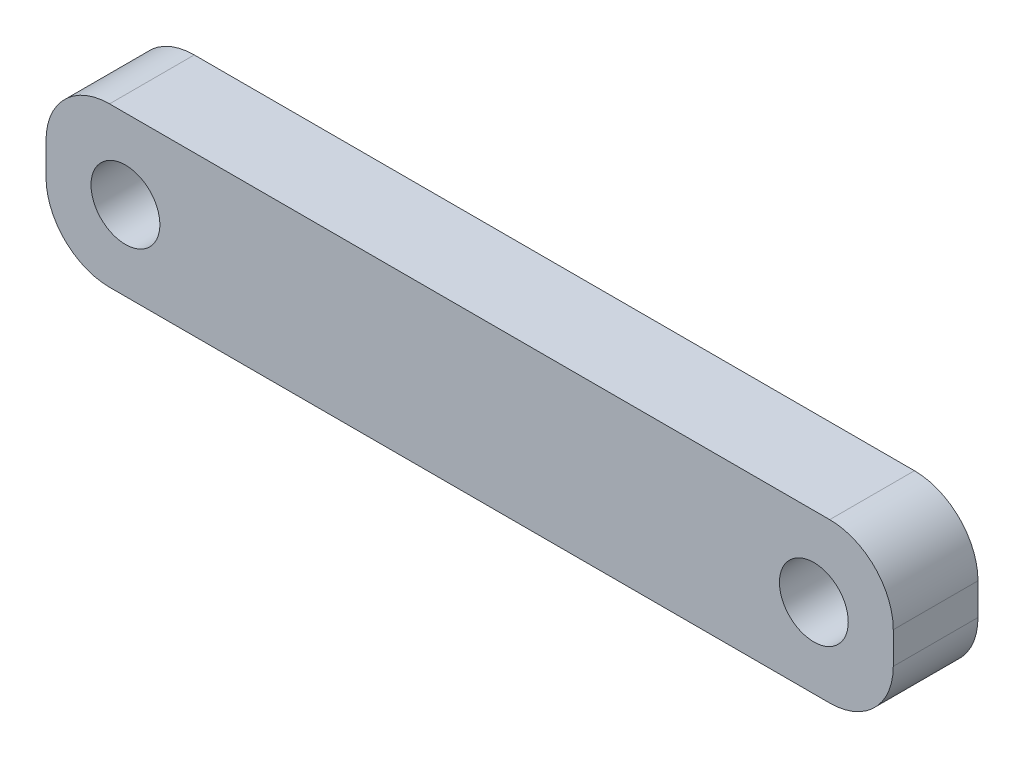
ISO-10303-21;
HEADER;
FILE_DESCRIPTION(('STEP AP214'),'2;1');
FILE_NAME('part.step','',(''),(''),'','','');
FILE_SCHEMA(('AUTOMOTIVE_DESIGN { 1 0 10303 214 1 1 1 1 }'));
ENDSEC;
DATA;
#1=APPLICATION_CONTEXT('core data for automotive mechanical design processes');
#2=APPLICATION_PROTOCOL_DEFINITION('international standard','automotive_design',2000,#1);
#3=PRODUCT_CONTEXT('',#1,'mechanical');
#4=PRODUCT('Part','Part','',(#3));
#5=PRODUCT_RELATED_PRODUCT_CATEGORY('part','',(#4));
#6=PRODUCT_DEFINITION_FORMATION('','',#4);
#7=PRODUCT_DEFINITION_CONTEXT('part definition',#1,'design');
#8=PRODUCT_DEFINITION('design','',#6,#7);
#9=PRODUCT_DEFINITION_SHAPE('','',#8);
#10=(LENGTH_UNIT() NAMED_UNIT(*) SI_UNIT(.MILLI.,.METRE.));
#11=(NAMED_UNIT(*) PLANE_ANGLE_UNIT() SI_UNIT($,.RADIAN.));
#12=(NAMED_UNIT(*) SI_UNIT($,.STERADIAN.) SOLID_ANGLE_UNIT());
#13=UNCERTAINTY_MEASURE_WITH_UNIT(LENGTH_MEASURE(1.E-05),#10,'distance_accuracy_value','');
#14=(GEOMETRIC_REPRESENTATION_CONTEXT(3) GLOBAL_UNCERTAINTY_ASSIGNED_CONTEXT((#13)) GLOBAL_UNIT_ASSIGNED_CONTEXT((#10,
#11,#12)) REPRESENTATION_CONTEXT('',''));
#15=CARTESIAN_POINT('',(0.,0.,0.));
#16=DIRECTION('',(0.,0.,1.));
#17=DIRECTION('',(1.,0.,0.));
#18=AXIS2_PLACEMENT_3D('',#15,#16,#17);
#19=CARTESIAN_POINT('',(0.,0.,4.));
#20=DIRECTION('',(0.,0.,1.));
#21=DIRECTION('',(1.,0.,0.));
#22=AXIS2_PLACEMENT_3D('',#19,#20,#21);
#23=PLANE('',#22);
#24=CARTESIAN_POINT('',(16.25,3.75,4.));
#25=DIRECTION('',(0.,0.,1.));
#26=DIRECTION('',(1.,0.,0.));
#27=AXIS2_PLACEMENT_3D('',#24,#25,#26);
#28=CIRCLE('',#27,1.625);
#29=CARTESIAN_POINT('',(17.875,3.75,4.));
#30=VERTEX_POINT('',#29);
#31=EDGE_CURVE('E131',#30,#30,#28,.T.);
#32=ORIENTED_EDGE('',*,*,#31,.F.);
#33=EDGE_LOOP('',(#32));
#34=FACE_BOUND('',#33,.T.);
#35=DIRECTION('',(1.,0.,0.));
#36=VECTOR('',#35,1.);
#37=CARTESIAN_POINT('',(-20.,0.,4.));
#38=LINE('',#37,#36);
#39=CARTESIAN_POINT('',(-17.,0.,4.));
#40=VERTEX_POINT('',#39);
#41=CARTESIAN_POINT('',(17.,0.,4.));
#42=VERTEX_POINT('',#41);
#43=EDGE_CURVE('E136',#40,#42,#38,.T.);
#44=ORIENTED_EDGE('',*,*,#43,.T.);
#45=CARTESIAN_POINT('',(17.,3.,4.));
#46=DIRECTION('',(0.,0.,1.));
#47=DIRECTION('',(1.,0.,0.));
#48=AXIS2_PLACEMENT_3D('',#45,#46,#47);
#49=CIRCLE('',#48,3.);
#50=CARTESIAN_POINT('',(20.,3.,4.));
#51=VERTEX_POINT('',#50);
#52=EDGE_CURVE('E151',#42,#51,#49,.T.);
#53=ORIENTED_EDGE('',*,*,#52,.T.);
#54=DIRECTION('',(0.,1.,0.));
#55=VECTOR('',#54,1.);
#56=CARTESIAN_POINT('',(20.,0.,4.));
#57=LINE('',#56,#55);
#58=CARTESIAN_POINT('',(20.,4.49999999999999,4.));
#59=VERTEX_POINT('',#58);
#60=EDGE_CURVE('E118',#51,#59,#57,.T.);
#61=ORIENTED_EDGE('',*,*,#60,.T.);
#62=CARTESIAN_POINT('',(17.,4.49999999999999,4.));
#63=DIRECTION('',(0.,0.,1.));
#64=DIRECTION('',(1.,0.,0.));
#65=AXIS2_PLACEMENT_3D('',#62,#63,#64);
#66=CIRCLE('',#65,3.);
#67=CARTESIAN_POINT('',(17.,7.49999999999999,4.));
#68=VERTEX_POINT('',#67);
#69=EDGE_CURVE('E149',#59,#68,#66,.T.);
#70=ORIENTED_EDGE('',*,*,#69,.T.);
#71=DIRECTION('',(-1.,0.,0.));
#72=VECTOR('',#71,1.);
#73=CARTESIAN_POINT('',(20.,7.49999999999999,4.));
#74=LINE('',#73,#72);
#75=CARTESIAN_POINT('',(-17.,7.49999999999999,4.));
#76=VERTEX_POINT('',#75);
#77=EDGE_CURVE('E171',#68,#76,#74,.T.);
#78=ORIENTED_EDGE('',*,*,#77,.T.);
#79=CARTESIAN_POINT('',(-17.,4.49999999999999,4.));
#80=DIRECTION('',(0.,0.,1.));
#81=DIRECTION('',(1.,0.,0.));
#82=AXIS2_PLACEMENT_3D('',#79,#80,#81);
#83=CIRCLE('',#82,3.);
#84=CARTESIAN_POINT('',(-20.,4.49999999999999,4.));
#85=VERTEX_POINT('',#84);
#86=EDGE_CURVE('E53',#76,#85,#83,.T.);
#87=ORIENTED_EDGE('',*,*,#86,.T.);
#88=DIRECTION('',(0.,-1.,0.));
#89=VECTOR('',#88,1.);
#90=CARTESIAN_POINT('',(-20.,7.49999999999999,4.));
#91=LINE('',#90,#89);
#92=CARTESIAN_POINT('',(-20.,3.,4.));
#93=VERTEX_POINT('',#92);
#94=EDGE_CURVE('E137',#85,#93,#91,.T.);
#95=ORIENTED_EDGE('',*,*,#94,.T.);
#96=CARTESIAN_POINT('',(-17.,3.,4.));
#97=DIRECTION('',(0.,0.,1.));
#98=DIRECTION('',(1.,0.,0.));
#99=AXIS2_PLACEMENT_3D('',#96,#97,#98);
#100=CIRCLE('',#99,3.);
#101=EDGE_CURVE('E147',#93,#40,#100,.T.);
#102=ORIENTED_EDGE('',*,*,#101,.T.);
#103=EDGE_LOOP('',(#44,#53,#61,#70,#78,#87,#95,#102));
#104=FACE_BOUND('',#103,.T.);
#105=CARTESIAN_POINT('',(-16.25,3.75,4.));
#106=DIRECTION('',(0.,0.,1.));
#107=DIRECTION('',(-1.,0.,0.));
#108=AXIS2_PLACEMENT_3D('',#105,#106,#107);
#109=CIRCLE('',#108,1.625);
#110=CARTESIAN_POINT('',(-17.875,3.75,4.));
#111=VERTEX_POINT('',#110);
#112=EDGE_CURVE('E183',#111,#111,#109,.T.);
#113=ORIENTED_EDGE('',*,*,#112,.F.);
#114=EDGE_LOOP('',(#113));
#115=FACE_BOUND('',#114,.T.);
#116=ADVANCED_FACE('F33',(#34,#104,#115),#23,.T.);
#117=CARTESIAN_POINT('',(0.,0.,0.));
#118=DIRECTION('',(0.,0.,1.));
#119=DIRECTION('',(1.,0.,0.));
#120=AXIS2_PLACEMENT_3D('',#117,#118,#119);
#121=PLANE('',#120);
#122=DIRECTION('',(0.,1.,0.));
#123=VECTOR('',#122,1.);
#124=CARTESIAN_POINT('',(20.,0.,0.));
#125=LINE('',#124,#123);
#126=CARTESIAN_POINT('',(20.,3.,0.));
#127=VERTEX_POINT('',#126);
#128=CARTESIAN_POINT('',(20.,4.49999999999999,0.));
#129=VERTEX_POINT('',#128);
#130=EDGE_CURVE('E115',#127,#129,#125,.T.);
#131=ORIENTED_EDGE('',*,*,#130,.F.);
#132=CARTESIAN_POINT('',(17.,3.,0.));
#133=DIRECTION('',(0.,0.,1.));
#134=DIRECTION('',(1.,0.,0.));
#135=AXIS2_PLACEMENT_3D('',#132,#133,#134);
#136=CIRCLE('',#135,3.);
#137=CARTESIAN_POINT('',(17.,0.,0.));
#138=VERTEX_POINT('',#137);
#139=EDGE_CURVE('E98',#127,#138,#136,.F.);
#140=ORIENTED_EDGE('',*,*,#139,.T.);
#141=DIRECTION('',(1.,0.,0.));
#142=VECTOR('',#141,1.);
#143=CARTESIAN_POINT('',(0.,0.,0.));
#144=LINE('',#143,#142);
#145=CARTESIAN_POINT('',(-17.,0.,0.));
#146=VERTEX_POINT('',#145);
#147=EDGE_CURVE('E126',#146,#138,#144,.T.);
#148=ORIENTED_EDGE('',*,*,#147,.F.);
#149=CARTESIAN_POINT('',(-17.,3.,0.));
#150=DIRECTION('',(0.,0.,1.));
#151=DIRECTION('',(1.,0.,0.));
#152=AXIS2_PLACEMENT_3D('',#149,#150,#151);
#153=CIRCLE('',#152,3.);
#154=CARTESIAN_POINT('',(-20.,3.,0.));
#155=VERTEX_POINT('',#154);
#156=EDGE_CURVE('E140',#146,#155,#153,.F.);
#157=ORIENTED_EDGE('',*,*,#156,.T.);
#158=DIRECTION('',(0.,-1.,0.));
#159=VECTOR('',#158,1.);
#160=CARTESIAN_POINT('',(-20.,7.49999999999999,0.));
#161=LINE('',#160,#159);
#162=CARTESIAN_POINT('',(-20.,4.49999999999999,0.));
#163=VERTEX_POINT('',#162);
#164=EDGE_CURVE('E129',#163,#155,#161,.T.);
#165=ORIENTED_EDGE('',*,*,#164,.F.);
#166=CARTESIAN_POINT('',(-17.,4.49999999999999,0.));
#167=DIRECTION('',(0.,0.,1.));
#168=DIRECTION('',(1.,0.,0.));
#169=AXIS2_PLACEMENT_3D('',#166,#167,#168);
#170=CIRCLE('',#169,3.);
#171=CARTESIAN_POINT('',(-17.,7.49999999999999,0.));
#172=VERTEX_POINT('',#171);
#173=EDGE_CURVE('E119',#163,#172,#170,.F.);
#174=ORIENTED_EDGE('',*,*,#173,.T.);
#175=DIRECTION('',(-1.,0.,0.));
#176=VECTOR('',#175,1.);
#177=CARTESIAN_POINT('',(20.,7.49999999999999,0.));
#178=LINE('',#177,#176);
#179=CARTESIAN_POINT('',(17.,7.49999999999999,0.));
#180=VERTEX_POINT('',#179);
#181=EDGE_CURVE('E125',#180,#172,#178,.T.);
#182=ORIENTED_EDGE('',*,*,#181,.F.);
#183=CARTESIAN_POINT('',(17.,4.49999999999999,0.));
#184=DIRECTION('',(0.,0.,1.));
#185=DIRECTION('',(1.,0.,0.));
#186=AXIS2_PLACEMENT_3D('',#183,#184,#185);
#187=CIRCLE('',#186,3.);
#188=EDGE_CURVE('E109',#180,#129,#187,.F.);
#189=ORIENTED_EDGE('',*,*,#188,.T.);
#190=EDGE_LOOP('',(#131,#140,#148,#157,#165,#174,#182,#189));
#191=FACE_BOUND('',#190,.T.);
#192=CARTESIAN_POINT('',(16.25,3.75,0.));
#193=DIRECTION('',(0.,0.,1.));
#194=DIRECTION('',(1.,0.,0.));
#195=AXIS2_PLACEMENT_3D('',#192,#193,#194);
#196=CIRCLE('',#195,1.625);
#197=CARTESIAN_POINT('',(17.875,3.75,0.));
#198=VERTEX_POINT('',#197);
#199=EDGE_CURVE('E174',#198,#198,#196,.T.);
#200=ORIENTED_EDGE('',*,*,#199,.T.);
#201=EDGE_LOOP('',(#200));
#202=FACE_BOUND('',#201,.T.);
#203=CARTESIAN_POINT('',(-16.25,3.75,0.));
#204=DIRECTION('',(0.,0.,1.));
#205=DIRECTION('',(-1.,0.,0.));
#206=AXIS2_PLACEMENT_3D('',#203,#204,#205);
#207=CIRCLE('',#206,1.625);
#208=CARTESIAN_POINT('',(-17.875,3.75,0.));
#209=VERTEX_POINT('',#208);
#210=EDGE_CURVE('E185',#209,#209,#207,.T.);
#211=ORIENTED_EDGE('',*,*,#210,.T.);
#212=EDGE_LOOP('',(#211));
#213=FACE_BOUND('',#212,.T.);
#214=ADVANCED_FACE('F122',(#191,#202,#213),#121,.F.);
#215=CARTESIAN_POINT('',(0.,0.,4.));
#216=DIRECTION('',(0.,1.,0.));
#217=DIRECTION('',(0.,0.,1.));
#218=AXIS2_PLACEMENT_3D('',#215,#216,#217);
#219=PLANE('',#218);
#220=ORIENTED_EDGE('',*,*,#147,.T.);
#221=DIRECTION('',(0.,0.,-1.));
#222=VECTOR('',#221,1.);
#223=CARTESIAN_POINT('',(17.,0.,4.));
#224=LINE('',#223,#222);
#225=EDGE_CURVE('E103',#138,#42,#224,.F.);
#226=ORIENTED_EDGE('',*,*,#225,.T.);
#227=ORIENTED_EDGE('',*,*,#43,.F.);
#228=DIRECTION('',(0.,0.,-1.));
#229=VECTOR('',#228,1.);
#230=CARTESIAN_POINT('',(-17.,0.,4.));
#231=LINE('',#230,#229);
#232=EDGE_CURVE('E108',#40,#146,#231,.T.);
#233=ORIENTED_EDGE('',*,*,#232,.T.);
#234=EDGE_LOOP('',(#220,#226,#227,#233));
#235=FACE_BOUND('',#234,.T.);
#236=ADVANCED_FACE('F168',(#235),#219,.F.);
#237=CARTESIAN_POINT('',(20.,0.,4.));
#238=DIRECTION('',(-1.,0.,0.));
#239=DIRECTION('',(0.,0.,1.));
#240=AXIS2_PLACEMENT_3D('',#237,#238,#239);
#241=PLANE('',#240);
#242=ORIENTED_EDGE('',*,*,#60,.F.);
#243=DIRECTION('',(0.,0.,-1.));
#244=VECTOR('',#243,1.);
#245=CARTESIAN_POINT('',(20.,3.,4.));
#246=LINE('',#245,#244);
#247=EDGE_CURVE('E102',#51,#127,#246,.T.);
#248=ORIENTED_EDGE('',*,*,#247,.T.);
#249=ORIENTED_EDGE('',*,*,#130,.T.);
#250=DIRECTION('',(0.,0.,-1.));
#251=VECTOR('',#250,1.);
#252=CARTESIAN_POINT('',(20.,4.49999999999999,4.));
#253=LINE('',#252,#251);
#254=EDGE_CURVE('E120',#129,#59,#253,.F.);
#255=ORIENTED_EDGE('',*,*,#254,.T.);
#256=EDGE_LOOP('',(#242,#248,#249,#255));
#257=FACE_BOUND('',#256,.T.);
#258=ADVANCED_FACE('F114',(#257),#241,.F.);
#259=CARTESIAN_POINT('',(20.,7.49999999999999,4.));
#260=DIRECTION('',(0.,-1.,0.));
#261=DIRECTION('',(0.,0.,-1.));
#262=AXIS2_PLACEMENT_3D('',#259,#260,#261);
#263=PLANE('',#262);
#264=ORIENTED_EDGE('',*,*,#77,.F.);
#265=DIRECTION('',(0.,0.,-1.));
#266=VECTOR('',#265,1.);
#267=CARTESIAN_POINT('',(17.,7.49999999999999,4.));
#268=LINE('',#267,#266);
#269=EDGE_CURVE('E155',#68,#180,#268,.T.);
#270=ORIENTED_EDGE('',*,*,#269,.T.);
#271=ORIENTED_EDGE('',*,*,#181,.T.);
#272=DIRECTION('',(0.,0.,-1.));
#273=VECTOR('',#272,1.);
#274=CARTESIAN_POINT('',(-17.,7.49999999999999,4.));
#275=LINE('',#274,#273);
#276=EDGE_CURVE('E153',#172,#76,#275,.F.);
#277=ORIENTED_EDGE('',*,*,#276,.T.);
#278=EDGE_LOOP('',(#264,#270,#271,#277));
#279=FACE_BOUND('',#278,.T.);
#280=ADVANCED_FACE('F214',(#279),#263,.F.);
#281=CARTESIAN_POINT('',(-20.,7.49999999999999,4.));
#282=DIRECTION('',(1.,0.,0.));
#283=DIRECTION('',(0.,0.,-1.));
#284=AXIS2_PLACEMENT_3D('',#281,#282,#283);
#285=PLANE('',#284);
#286=ORIENTED_EDGE('',*,*,#164,.T.);
#287=DIRECTION('',(0.,0.,-1.));
#288=VECTOR('',#287,1.);
#289=CARTESIAN_POINT('',(-20.,3.,4.));
#290=LINE('',#289,#288);
#291=EDGE_CURVE('E11',#155,#93,#290,.F.);
#292=ORIENTED_EDGE('',*,*,#291,.T.);
#293=ORIENTED_EDGE('',*,*,#94,.F.);
#294=DIRECTION('',(0.,0.,-1.));
#295=VECTOR('',#294,1.);
#296=CARTESIAN_POINT('',(-20.,4.49999999999999,4.));
#297=LINE('',#296,#295);
#298=EDGE_CURVE('E41',#85,#163,#297,.T.);
#299=ORIENTED_EDGE('',*,*,#298,.T.);
#300=EDGE_LOOP('',(#286,#292,#293,#299));
#301=FACE_BOUND('',#300,.T.);
#302=ADVANCED_FACE('F160',(#301),#285,.F.);
#303=CARTESIAN_POINT('',(16.25,3.75,4.));
#304=DIRECTION('',(0.,0.,-1.));
#305=DIRECTION('',(-1.,0.,0.));
#306=AXIS2_PLACEMENT_3D('',#303,#304,#305);
#307=CYLINDRICAL_SURFACE('',#306,1.625);
#308=ORIENTED_EDGE('',*,*,#31,.T.);
#309=EDGE_LOOP('',(#308));
#310=FACE_BOUND('',#309,.T.);
#311=ORIENTED_EDGE('',*,*,#199,.F.);
#312=EDGE_LOOP('',(#311));
#313=FACE_BOUND('',#312,.T.);
#314=ADVANCED_FACE('F193',(#310,#313),#307,.F.);
#315=CARTESIAN_POINT('',(-16.25,3.75,4.));
#316=DIRECTION('',(0.,0.,-1.));
#317=DIRECTION('',(-1.,0.,0.));
#318=AXIS2_PLACEMENT_3D('',#315,#316,#317);
#319=CYLINDRICAL_SURFACE('',#318,1.625);
#320=ORIENTED_EDGE('',*,*,#112,.T.);
#321=EDGE_LOOP('',(#320));
#322=FACE_BOUND('',#321,.T.);
#323=ORIENTED_EDGE('',*,*,#210,.F.);
#324=EDGE_LOOP('',(#323));
#325=FACE_BOUND('',#324,.T.);
#326=ADVANCED_FACE('F196',(#322,#325),#319,.F.);
#327=CARTESIAN_POINT('',(17.,3.,4.));
#328=DIRECTION('',(0.,0.,-1.));
#329=DIRECTION('',(-1.,0.,0.));
#330=AXIS2_PLACEMENT_3D('',#327,#328,#329);
#331=CYLINDRICAL_SURFACE('',#330,3.);
#332=ORIENTED_EDGE('',*,*,#52,.F.);
#333=ORIENTED_EDGE('',*,*,#225,.F.);
#334=ORIENTED_EDGE('',*,*,#139,.F.);
#335=ORIENTED_EDGE('',*,*,#247,.F.);
#336=EDGE_LOOP('',(#332,#333,#334,#335));
#337=FACE_BOUND('',#336,.T.);
#338=ADVANCED_FACE('F101',(#337),#331,.T.);
#339=CARTESIAN_POINT('',(17.,4.49999999999999,4.));
#340=DIRECTION('',(0.,0.,-1.));
#341=DIRECTION('',(-1.,0.,0.));
#342=AXIS2_PLACEMENT_3D('',#339,#340,#341);
#343=CYLINDRICAL_SURFACE('',#342,3.);
#344=ORIENTED_EDGE('',*,*,#69,.F.);
#345=ORIENTED_EDGE('',*,*,#254,.F.);
#346=ORIENTED_EDGE('',*,*,#188,.F.);
#347=ORIENTED_EDGE('',*,*,#269,.F.);
#348=EDGE_LOOP('',(#344,#345,#346,#347));
#349=FACE_BOUND('',#348,.T.);
#350=ADVANCED_FACE('F209',(#349),#343,.T.);
#351=CARTESIAN_POINT('',(-17.,3.,4.));
#352=DIRECTION('',(0.,0.,-1.));
#353=DIRECTION('',(-1.,0.,0.));
#354=AXIS2_PLACEMENT_3D('',#351,#352,#353);
#355=CYLINDRICAL_SURFACE('',#354,3.);
#356=ORIENTED_EDGE('',*,*,#101,.F.);
#357=ORIENTED_EDGE('',*,*,#291,.F.);
#358=ORIENTED_EDGE('',*,*,#156,.F.);
#359=ORIENTED_EDGE('',*,*,#232,.F.);
#360=EDGE_LOOP('',(#356,#357,#358,#359));
#361=FACE_BOUND('',#360,.T.);
#362=ADVANCED_FACE('F165',(#361),#355,.T.);
#363=CARTESIAN_POINT('',(-17.,4.49999999999999,4.));
#364=DIRECTION('',(0.,0.,-1.));
#365=DIRECTION('',(-1.,0.,0.));
#366=AXIS2_PLACEMENT_3D('',#363,#364,#365);
#367=CYLINDRICAL_SURFACE('',#366,3.);
#368=ORIENTED_EDGE('',*,*,#86,.F.);
#369=ORIENTED_EDGE('',*,*,#276,.F.);
#370=ORIENTED_EDGE('',*,*,#173,.F.);
#371=ORIENTED_EDGE('',*,*,#298,.F.);
#372=EDGE_LOOP('',(#368,#369,#370,#371));
#373=FACE_BOUND('',#372,.T.);
#374=ADVANCED_FACE('F35',(#373),#367,.T.);
#375=CLOSED_SHELL('',(#116,#214,#236,#258,#280,#302,#314,#326,#338,#350,#362,#374));
#376=MANIFOLD_SOLID_BREP('B2',#375);
#377=ADVANCED_BREP_SHAPE_REPRESENTATION('',(#18,#376),#14);
#378=SHAPE_DEFINITION_REPRESENTATION(#9,#377);
ENDSEC;
END-ISO-10303-21;
